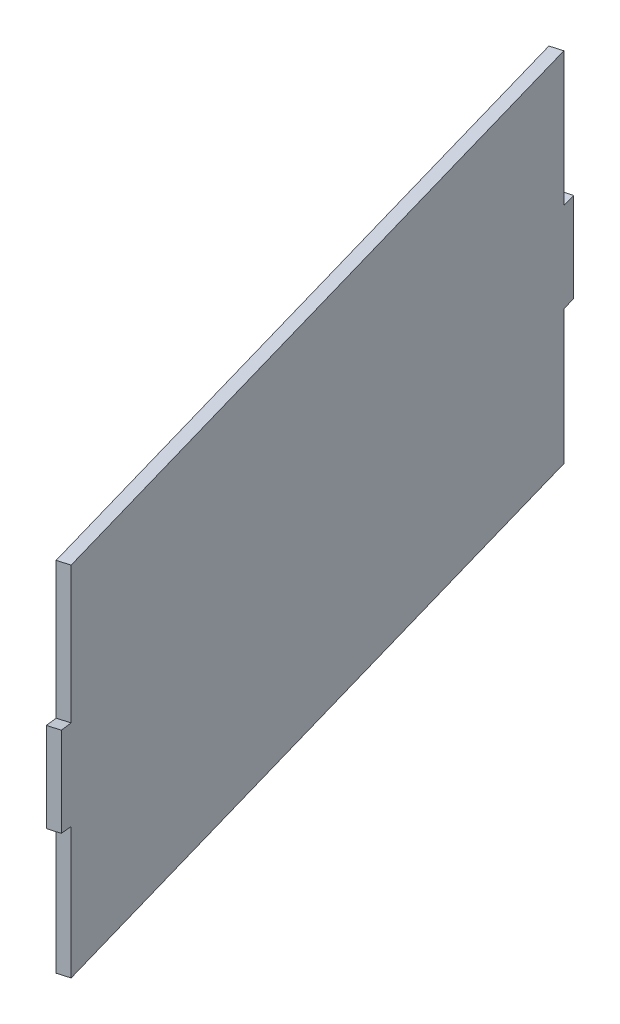
ISO-10303-21;
HEADER;
FILE_DESCRIPTION(('STEP AP214'),'2;1');
FILE_NAME('part.step','',(''),(''),'','','');
FILE_SCHEMA(('AUTOMOTIVE_DESIGN { 1 0 10303 214 1 1 1 1 }'));
ENDSEC;
DATA;
#1=APPLICATION_CONTEXT('core data for automotive mechanical design processes');
#2=APPLICATION_PROTOCOL_DEFINITION('international standard','automotive_design',2000,#1);
#3=PRODUCT_CONTEXT('',#1,'mechanical');
#4=PRODUCT('Part','Part','',(#3));
#5=PRODUCT_RELATED_PRODUCT_CATEGORY('part','',(#4));
#6=PRODUCT_DEFINITION_FORMATION('','',#4);
#7=PRODUCT_DEFINITION_CONTEXT('part definition',#1,'design');
#8=PRODUCT_DEFINITION('design','',#6,#7);
#9=PRODUCT_DEFINITION_SHAPE('','',#8);
#10=(LENGTH_UNIT() NAMED_UNIT(*) SI_UNIT(.MILLI.,.METRE.));
#11=(NAMED_UNIT(*) PLANE_ANGLE_UNIT() SI_UNIT($,.RADIAN.));
#12=(NAMED_UNIT(*) SI_UNIT($,.STERADIAN.) SOLID_ANGLE_UNIT());
#13=UNCERTAINTY_MEASURE_WITH_UNIT(LENGTH_MEASURE(1.E-05),#10,'distance_accuracy_value','');
#14=(GEOMETRIC_REPRESENTATION_CONTEXT(3) GLOBAL_UNCERTAINTY_ASSIGNED_CONTEXT((#13)) GLOBAL_UNIT_ASSIGNED_CONTEXT((#10,
#11,#12)) REPRESENTATION_CONTEXT('',''));
#15=CARTESIAN_POINT('',(0.,0.,0.));
#16=DIRECTION('',(0.,0.,1.));
#17=DIRECTION('',(1.,0.,0.));
#18=AXIS2_PLACEMENT_3D('',#15,#16,#17);
#19=CARTESIAN_POINT('',(242.936015541515,-154.081628831697,-2777.81556036248));
#20=DIRECTION('',(0.,1.,0.));
#21=DIRECTION('',(0.,0.,1.));
#22=AXIS2_PLACEMENT_3D('',#19,#20,#21);
#23=PLANE('',#22);
#24=DIRECTION('',(0.276516685703619,0.,0.961009116776467));
#25=VECTOR('',#24,1.);
#26=CARTESIAN_POINT('',(252.699868167964,-154.081628831697,-2780.62496988922));
#27=LINE('',#26,#25);
#28=CARTESIAN_POINT('',(249.381667939521,-154.081628831698,-2792.15707929054));
#29=VERTEX_POINT('',#28);
#30=CARTESIAN_POINT('',(252.699868167964,-154.081628831697,-2780.62496988922));
#31=VERTEX_POINT('',#30);
#32=EDGE_CURVE('E158',#29,#31,#27,.T.);
#33=ORIENTED_EDGE('',*,*,#32,.F.);
#34=DIRECTION('',(0.96100911677647,0.,-0.276516685703609));
#35=VECTOR('',#34,1.);
#36=CARTESIAN_POINT('',(239.617815313072,-154.081628831698,-2789.34766976379));
#37=LINE('',#36,#35);
#38=CARTESIAN_POINT('',(239.617815313072,-154.081628831698,-2789.34766976379));
#39=VERTEX_POINT('',#38);
#40=EDGE_CURVE('E11',#39,#29,#37,.T.);
#41=ORIENTED_EDGE('',*,*,#40,.F.);
#42=DIRECTION('',(0.276516685703619,0.,0.961009116776467));
#43=VECTOR('',#42,1.);
#44=CARTESIAN_POINT('',(242.936015541515,-154.081628831697,-2777.81556036248));
#45=LINE('',#44,#43);
#46=CARTESIAN_POINT('',(242.936015541515,-154.081628831697,-2777.81556036248));
#47=VERTEX_POINT('',#46);
#48=EDGE_CURVE('E190',#39,#47,#45,.T.);
#49=ORIENTED_EDGE('',*,*,#48,.T.);
#50=DIRECTION('',(0.96100911677647,0.,-0.276516685703609));
#51=VECTOR('',#50,1.);
#52=CARTESIAN_POINT('',(242.936015541515,-154.081628831697,-2777.81556036248));
#53=LINE('',#52,#51);
#54=EDGE_CURVE('E40',#47,#31,#53,.T.);
#55=ORIENTED_EDGE('',*,*,#54,.T.);
#56=EDGE_LOOP('',(#33,#41,#49,#55));
#57=FACE_BOUND('',#56,.T.);
#58=ADVANCED_FACE('F37',(#57),#23,.T.);
#59=CARTESIAN_POINT('',(239.617815313072,-154.081628831698,-2789.34766976379));
#60=DIRECTION('',(-0.276516685703609,0.,-0.96100911677647));
#61=DIRECTION('',(-0.96100911677647,0.,0.276516685703609));
#62=AXIS2_PLACEMENT_3D('',#59,#60,#61);
#63=PLANE('',#62);
#64=DIRECTION('',(0.,1.,0.));
#65=VECTOR('',#64,1.);
#66=CARTESIAN_POINT('',(249.381667939521,-154.081628831698,-2792.15707929054));
#67=LINE('',#66,#65);
#68=CARTESIAN_POINT('',(249.381667939521,-229.081628831698,-2792.15707929054));
#69=VERTEX_POINT('',#68);
#70=EDGE_CURVE('E188',#69,#29,#67,.T.);
#71=ORIENTED_EDGE('',*,*,#70,.F.);
#72=DIRECTION('',(0.96100911677647,0.,-0.276516685703609));
#73=VECTOR('',#72,1.);
#74=CARTESIAN_POINT('',(239.617815313072,-229.081628831698,-2789.34766976379));
#75=LINE('',#74,#73);
#76=CARTESIAN_POINT('',(239.617815313072,-229.081628831698,-2789.34766976379));
#77=VERTEX_POINT('',#76);
#78=EDGE_CURVE('E46',#77,#69,#75,.T.);
#79=ORIENTED_EDGE('',*,*,#78,.F.);
#80=DIRECTION('',(0.,1.,0.));
#81=VECTOR('',#80,1.);
#82=CARTESIAN_POINT('',(239.617815313072,-154.081628831698,-2789.34766976379));
#83=LINE('',#82,#81);
#84=EDGE_CURVE('E148',#77,#39,#83,.T.);
#85=ORIENTED_EDGE('',*,*,#84,.T.);
#86=ORIENTED_EDGE('',*,*,#40,.T.);
#87=EDGE_LOOP('',(#71,#79,#85,#86));
#88=FACE_BOUND('',#87,.T.);
#89=ADVANCED_FACE('F210',(#88),#63,.T.);
#90=CARTESIAN_POINT('',(239.617815313072,-229.081628831698,-2789.34766976379));
#91=DIRECTION('',(0.,-1.,0.));
#92=DIRECTION('',(1.,0.,0.));
#93=AXIS2_PLACEMENT_3D('',#90,#91,#92);
#94=PLANE('',#93);
#95=DIRECTION('',(-0.276516685703619,0.,-0.961009116776467));
#96=VECTOR('',#95,1.);
#97=CARTESIAN_POINT('',(249.381667939521,-229.081628831698,-2792.15707929054));
#98=LINE('',#97,#96);
#99=CARTESIAN_POINT('',(252.699868167964,-229.081628831698,-2780.62496988922));
#100=VERTEX_POINT('',#99);
#101=EDGE_CURVE('E135',#100,#69,#98,.T.);
#102=ORIENTED_EDGE('',*,*,#101,.F.);
#103=DIRECTION('',(0.96100911677647,0.,-0.276516685703609));
#104=VECTOR('',#103,1.);
#105=CARTESIAN_POINT('',(242.936015541515,-229.081628831698,-2777.81556036248));
#106=LINE('',#105,#104);
#107=CARTESIAN_POINT('',(242.936015541515,-229.081628831698,-2777.81556036248));
#108=VERTEX_POINT('',#107);
#109=EDGE_CURVE('E130',#108,#100,#106,.T.);
#110=ORIENTED_EDGE('',*,*,#109,.F.);
#111=DIRECTION('',(-0.276516685703619,0.,-0.961009116776467));
#112=VECTOR('',#111,1.);
#113=CARTESIAN_POINT('',(239.617815313072,-229.081628831698,-2789.34766976379));
#114=LINE('',#113,#112);
#115=EDGE_CURVE('E133',#108,#77,#114,.T.);
#116=ORIENTED_EDGE('',*,*,#115,.T.);
#117=ORIENTED_EDGE('',*,*,#78,.T.);
#118=EDGE_LOOP('',(#102,#110,#116,#117));
#119=FACE_BOUND('',#118,.T.);
#120=ADVANCED_FACE('F132',(#119),#94,.T.);
#121=CARTESIAN_POINT('',(242.936015541515,-229.081628831698,-2777.81556036248));
#122=DIRECTION('',(-0.276516685703609,0.,-0.96100911677647));
#123=DIRECTION('',(-0.96100911677647,0.,0.276516685703609));
#124=AXIS2_PLACEMENT_3D('',#121,#122,#123);
#125=PLANE('',#124);
#126=DIRECTION('',(0.,1.,0.));
#127=VECTOR('',#126,1.);
#128=CARTESIAN_POINT('',(252.699868167964,-229.081628831698,-2780.62496988922));
#129=LINE('',#128,#127);
#130=CARTESIAN_POINT('',(252.699868167964,-341.581628831697,-2780.62496988922));
#131=VERTEX_POINT('',#130);
#132=EDGE_CURVE('E185',#131,#100,#129,.T.);
#133=ORIENTED_EDGE('',*,*,#132,.F.);
#134=DIRECTION('',(0.96100911677647,0.,-0.276516685703609));
#135=VECTOR('',#134,1.);
#136=CARTESIAN_POINT('',(242.936015541515,-341.581628831697,-2777.81556036248));
#137=LINE('',#136,#135);
#138=CARTESIAN_POINT('',(242.936015541515,-341.581628831697,-2777.81556036248));
#139=VERTEX_POINT('',#138);
#140=EDGE_CURVE('E140',#139,#131,#137,.T.);
#141=ORIENTED_EDGE('',*,*,#140,.F.);
#142=DIRECTION('',(0.,1.,0.));
#143=VECTOR('',#142,1.);
#144=CARTESIAN_POINT('',(242.936015541515,-229.081628831698,-2777.81556036248));
#145=LINE('',#144,#143);
#146=EDGE_CURVE('E146',#139,#108,#145,.T.);
#147=ORIENTED_EDGE('',*,*,#146,.T.);
#148=ORIENTED_EDGE('',*,*,#109,.T.);
#149=EDGE_LOOP('',(#133,#141,#147,#148));
#150=FACE_BOUND('',#149,.T.);
#151=ADVANCED_FACE('F150',(#150),#125,.T.);
#152=CARTESIAN_POINT('',(242.936015541515,-341.581628831697,-2777.81556036248));
#153=DIRECTION('',(0.,-1.,0.));
#154=DIRECTION('',(1.,0.,0.));
#155=AXIS2_PLACEMENT_3D('',#152,#153,#154);
#156=PLANE('',#155);
#157=DIRECTION('',(-0.276516685703609,0.,-0.96100911677647));
#158=VECTOR('',#157,1.);
#159=CARTESIAN_POINT('',(252.699868167964,-341.581628831697,-2780.62496988922));
#160=LINE('',#159,#158);
#161=CARTESIAN_POINT('',(419.711839480079,-341.581628831697,-2200.18973635764));
#162=VERTEX_POINT('',#161);
#163=EDGE_CURVE('E182',#162,#131,#160,.T.);
#164=ORIENTED_EDGE('',*,*,#163,.F.);
#165=DIRECTION('',(0.96100911677647,0.,-0.276516685703609));
#166=VECTOR('',#165,1.);
#167=CARTESIAN_POINT('',(409.94798685363,-341.581628831697,-2197.3803268309));
#168=LINE('',#167,#166);
#169=CARTESIAN_POINT('',(409.94798685363,-341.581628831697,-2197.3803268309));
#170=VERTEX_POINT('',#169);
#171=EDGE_CURVE('E194',#170,#162,#168,.T.);
#172=ORIENTED_EDGE('',*,*,#171,.F.);
#173=DIRECTION('',(-0.276516685703609,0.,-0.96100911677647));
#174=VECTOR('',#173,1.);
#175=CARTESIAN_POINT('',(242.936015541515,-341.581628831697,-2777.81556036248));
#176=LINE('',#175,#174);
#177=EDGE_CURVE('E151',#170,#139,#176,.T.);
#178=ORIENTED_EDGE('',*,*,#177,.T.);
#179=ORIENTED_EDGE('',*,*,#140,.T.);
#180=EDGE_LOOP('',(#164,#172,#178,#179));
#181=FACE_BOUND('',#180,.T.);
#182=ADVANCED_FACE('F223',(#181),#156,.T.);
#183=CARTESIAN_POINT('',(409.94798685363,-231.51240132609,-2197.3803268309));
#184=DIRECTION('',(0.276516685703609,0.,0.96100911677647));
#185=DIRECTION('',(0.96100911677647,0.,-0.276516685703609));
#186=AXIS2_PLACEMENT_3D('',#183,#184,#185);
#187=PLANE('',#186);
#188=DIRECTION('',(0.,-1.,0.));
#189=VECTOR('',#188,1.);
#190=CARTESIAN_POINT('',(419.711839480079,-231.51240132609,-2200.18973635764));
#191=LINE('',#190,#189);
#192=CARTESIAN_POINT('',(419.711839480079,-231.51240132609,-2200.18973635764));
#193=VERTEX_POINT('',#192);
#194=EDGE_CURVE('E179',#193,#162,#191,.T.);
#195=ORIENTED_EDGE('',*,*,#194,.F.);
#196=DIRECTION('',(0.96100911677647,0.,-0.276516685703609));
#197=VECTOR('',#196,1.);
#198=CARTESIAN_POINT('',(409.94798685363,-231.51240132609,-2197.3803268309));
#199=LINE('',#198,#197);
#200=CARTESIAN_POINT('',(409.94798685363,-231.51240132609,-2197.3803268309));
#201=VERTEX_POINT('',#200);
#202=EDGE_CURVE('E196',#201,#193,#199,.T.);
#203=ORIENTED_EDGE('',*,*,#202,.F.);
#204=DIRECTION('',(0.,-1.,0.));
#205=VECTOR('',#204,1.);
#206=CARTESIAN_POINT('',(409.94798685363,-231.51240132609,-2197.3803268309));
#207=LINE('',#206,#205);
#208=EDGE_CURVE('E153',#201,#170,#207,.T.);
#209=ORIENTED_EDGE('',*,*,#208,.T.);
#210=ORIENTED_EDGE('',*,*,#171,.T.);
#211=EDGE_LOOP('',(#195,#203,#209,#210));
#212=FACE_BOUND('',#211,.T.);
#213=ADVANCED_FACE('F226',(#212),#187,.T.);
#214=CARTESIAN_POINT('',(413.266187082074,-229.081628831698,-2185.84821742958));
#215=DIRECTION('',(0.054897466523003,-0.98009436522182,0.190791256167033));
#216=DIRECTION('',(0.,-0.191079404473001,-0.981574582589751));
#217=AXIS2_PLACEMENT_3D('',#214,#215,#216);
#218=PLANE('',#217);
#219=DIRECTION('',(-0.271012445547912,-0.198532202074219,-0.941879620279418));
#220=VECTOR('',#219,1.);
#221=CARTESIAN_POINT('',(423.030039708523,-229.081628831698,-2188.65762695633));
#222=LINE('',#221,#220);
#223=CARTESIAN_POINT('',(423.030039708523,-229.081628831698,-2188.65762695633));
#224=VERTEX_POINT('',#223);
#225=EDGE_CURVE('E176',#224,#193,#222,.T.);
#226=ORIENTED_EDGE('',*,*,#225,.F.);
#227=DIRECTION('',(0.96100911677647,0.,-0.276516685703609));
#228=VECTOR('',#227,1.);
#229=CARTESIAN_POINT('',(413.266187082074,-229.081628831698,-2185.84821742958));
#230=LINE('',#229,#228);
#231=CARTESIAN_POINT('',(413.266187082074,-229.081628831698,-2185.84821742958));
#232=VERTEX_POINT('',#231);
#233=EDGE_CURVE('E198',#232,#224,#230,.T.);
#234=ORIENTED_EDGE('',*,*,#233,.F.);
#235=DIRECTION('',(-0.271012445547912,-0.198532202074219,-0.941879620279418));
#236=VECTOR('',#235,1.);
#237=CARTESIAN_POINT('',(413.266187082074,-229.081628831698,-2185.84821742958));
#238=LINE('',#237,#236);
#239=EDGE_CURVE('E380',#232,#201,#238,.T.);
#240=ORIENTED_EDGE('',*,*,#239,.T.);
#241=ORIENTED_EDGE('',*,*,#202,.T.);
#242=EDGE_LOOP('',(#226,#234,#240,#241));
#243=FACE_BOUND('',#242,.T.);
#244=ADVANCED_FACE('F230',(#243),#218,.T.);
#245=CARTESIAN_POINT('',(413.266187082074,-154.081628831698,-2185.84821742958));
#246=DIRECTION('',(0.276516685703609,0.,0.96100911677647));
#247=DIRECTION('',(0.96100911677647,0.,-0.276516685703609));
#248=AXIS2_PLACEMENT_3D('',#245,#246,#247);
#249=PLANE('',#248);
#250=DIRECTION('',(0.,-1.,0.));
#251=VECTOR('',#250,1.);
#252=CARTESIAN_POINT('',(423.030039708523,-154.081628831698,-2188.65762695633));
#253=LINE('',#252,#251);
#254=CARTESIAN_POINT('',(423.030039708523,-154.081628831698,-2188.65762695633));
#255=VERTEX_POINT('',#254);
#256=EDGE_CURVE('E173',#255,#224,#253,.T.);
#257=ORIENTED_EDGE('',*,*,#256,.F.);
#258=DIRECTION('',(0.96100911677647,0.,-0.276516685703609));
#259=VECTOR('',#258,1.);
#260=CARTESIAN_POINT('',(413.266187082074,-154.081628831698,-2185.84821742958));
#261=LINE('',#260,#259);
#262=CARTESIAN_POINT('',(413.266187082074,-154.081628831698,-2185.84821742958));
#263=VERTEX_POINT('',#262);
#264=EDGE_CURVE('E200',#263,#255,#261,.T.);
#265=ORIENTED_EDGE('',*,*,#264,.F.);
#266=DIRECTION('',(0.,-1.,0.));
#267=VECTOR('',#266,1.);
#268=CARTESIAN_POINT('',(413.266187082074,-154.081628831698,-2185.84821742958));
#269=LINE('',#268,#267);
#270=EDGE_CURVE('E384',#263,#232,#269,.T.);
#271=ORIENTED_EDGE('',*,*,#270,.T.);
#272=ORIENTED_EDGE('',*,*,#233,.T.);
#273=EDGE_LOOP('',(#257,#265,#271,#272));
#274=FACE_BOUND('',#273,.T.);
#275=ADVANCED_FACE('F234',(#274),#249,.T.);
#276=CARTESIAN_POINT('',(413.266187082074,-154.081628831698,-2185.84821742958));
#277=DIRECTION('',(-0.0492613335281761,0.98400341687963,-0.171203377852887));
#278=DIRECTION('',(0.,0.171411484504855,0.985199524451693));
#279=AXIS2_PLACEMENT_3D('',#276,#277,#278);
#280=PLANE('',#279);
#281=DIRECTION('',(0.272093363556582,0.178149587620102,0.945636254560522));
#282=VECTOR('',#281,1.);
#283=CARTESIAN_POINT('',(423.030039708523,-154.081628831698,-2188.65762695633));
#284=LINE('',#283,#282);
#285=CARTESIAN_POINT('',(419.711839480079,-156.254177234243,-2200.18973635764));
#286=VERTEX_POINT('',#285);
#287=EDGE_CURVE('E170',#286,#255,#284,.T.);
#288=ORIENTED_EDGE('',*,*,#287,.F.);
#289=DIRECTION('',(0.96100911677647,0.,-0.276516685703609));
#290=VECTOR('',#289,1.);
#291=CARTESIAN_POINT('',(409.94798685363,-156.254177234243,-2197.3803268309));
#292=LINE('',#291,#290);
#293=CARTESIAN_POINT('',(409.94798685363,-156.254177234243,-2197.3803268309));
#294=VERTEX_POINT('',#293);
#295=EDGE_CURVE('E202',#294,#286,#292,.T.);
#296=ORIENTED_EDGE('',*,*,#295,.F.);
#297=DIRECTION('',(0.272093363556582,0.178149587620102,0.945636254560522));
#298=VECTOR('',#297,1.);
#299=CARTESIAN_POINT('',(413.266187082074,-154.081628831698,-2185.84821742958));
#300=LINE('',#299,#298);
#301=EDGE_CURVE('E373',#294,#263,#300,.T.);
#302=ORIENTED_EDGE('',*,*,#301,.T.);
#303=ORIENTED_EDGE('',*,*,#264,.T.);
#304=EDGE_LOOP('',(#288,#296,#302,#303));
#305=FACE_BOUND('',#304,.T.);
#306=ADVANCED_FACE('F238',(#305),#280,.T.);
#307=CARTESIAN_POINT('',(409.94798685363,-41.5816288316975,-2197.3803268309));
#308=DIRECTION('',(0.276516685703609,0.,0.96100911677647));
#309=DIRECTION('',(0.96100911677647,0.,-0.276516685703609));
#310=AXIS2_PLACEMENT_3D('',#307,#308,#309);
#311=PLANE('',#310);
#312=DIRECTION('',(0.,-1.,0.));
#313=VECTOR('',#312,1.);
#314=CARTESIAN_POINT('',(419.711839480079,-41.5816288316975,-2200.18973635764));
#315=LINE('',#314,#313);
#316=CARTESIAN_POINT('',(419.711839480079,-41.5816288316975,-2200.18973635764));
#317=VERTEX_POINT('',#316);
#318=EDGE_CURVE('E167',#317,#286,#315,.T.);
#319=ORIENTED_EDGE('',*,*,#318,.F.);
#320=DIRECTION('',(0.96100911677647,0.,-0.276516685703609));
#321=VECTOR('',#320,1.);
#322=CARTESIAN_POINT('',(409.94798685363,-41.5816288316975,-2197.3803268309));
#323=LINE('',#322,#321);
#324=CARTESIAN_POINT('',(409.94798685363,-41.5816288316975,-2197.3803268309));
#325=VERTEX_POINT('',#324);
#326=EDGE_CURVE('E204',#325,#317,#323,.T.);
#327=ORIENTED_EDGE('',*,*,#326,.F.);
#328=DIRECTION('',(0.,-1.,0.));
#329=VECTOR('',#328,1.);
#330=CARTESIAN_POINT('',(409.94798685363,-41.5816288316975,-2197.3803268309));
#331=LINE('',#330,#329);
#332=EDGE_CURVE('E369',#325,#294,#331,.T.);
#333=ORIENTED_EDGE('',*,*,#332,.T.);
#334=ORIENTED_EDGE('',*,*,#295,.T.);
#335=EDGE_LOOP('',(#319,#327,#333,#334));
#336=FACE_BOUND('',#335,.T.);
#337=ADVANCED_FACE('F242',(#336),#311,.T.);
#338=CARTESIAN_POINT('',(242.936015541515,-41.5816288316974,-2777.81556036248));
#339=DIRECTION('',(0.,1.,0.));
#340=DIRECTION('',(-1.,0.,0.));
#341=AXIS2_PLACEMENT_3D('',#338,#339,#340);
#342=PLANE('',#341);
#343=DIRECTION('',(0.276516685703609,0.,0.96100911677647));
#344=VECTOR('',#343,1.);
#345=CARTESIAN_POINT('',(252.699868167964,-41.5816288316974,-2780.62496988922));
#346=LINE('',#345,#344);
#347=CARTESIAN_POINT('',(252.699868167964,-41.5816288316974,-2780.62496988922));
#348=VERTEX_POINT('',#347);
#349=EDGE_CURVE('E164',#348,#317,#346,.T.);
#350=ORIENTED_EDGE('',*,*,#349,.F.);
#351=DIRECTION('',(0.96100911677647,0.,-0.276516685703609));
#352=VECTOR('',#351,1.);
#353=CARTESIAN_POINT('',(242.936015541515,-41.5816288316974,-2777.81556036248));
#354=LINE('',#353,#352);
#355=CARTESIAN_POINT('',(242.936015541515,-41.5816288316974,-2777.81556036248));
#356=VERTEX_POINT('',#355);
#357=EDGE_CURVE('E205',#356,#348,#354,.T.);
#358=ORIENTED_EDGE('',*,*,#357,.F.);
#359=DIRECTION('',(0.276516685703609,0.,0.96100911677647));
#360=VECTOR('',#359,1.);
#361=CARTESIAN_POINT('',(242.936015541515,-41.5816288316974,-2777.81556036248));
#362=LINE('',#361,#360);
#363=EDGE_CURVE('E390',#356,#325,#362,.T.);
#364=ORIENTED_EDGE('',*,*,#363,.T.);
#365=ORIENTED_EDGE('',*,*,#326,.T.);
#366=EDGE_LOOP('',(#350,#358,#364,#365));
#367=FACE_BOUND('',#366,.T.);
#368=ADVANCED_FACE('F246',(#367),#342,.T.);
#369=CARTESIAN_POINT('',(242.936015541515,-41.5816288316974,-2777.81556036248));
#370=DIRECTION('',(-0.276516685703609,0.,-0.96100911677647));
#371=DIRECTION('',(-0.96100911677647,0.,0.276516685703609));
#372=AXIS2_PLACEMENT_3D('',#369,#370,#371);
#373=PLANE('',#372);
#374=DIRECTION('',(0.,1.,0.));
#375=VECTOR('',#374,1.);
#376=CARTESIAN_POINT('',(252.699868167964,-41.5816288316974,-2780.62496988922));
#377=LINE('',#376,#375);
#378=EDGE_CURVE('E161',#31,#348,#377,.T.);
#379=ORIENTED_EDGE('',*,*,#378,.F.);
#380=ORIENTED_EDGE('',*,*,#54,.F.);
#381=DIRECTION('',(0.,1.,0.));
#382=VECTOR('',#381,1.);
#383=CARTESIAN_POINT('',(242.936015541515,-41.5816288316974,-2777.81556036248));
#384=LINE('',#383,#382);
#385=EDGE_CURVE('E392',#47,#356,#384,.T.);
#386=ORIENTED_EDGE('',*,*,#385,.T.);
#387=ORIENTED_EDGE('',*,*,#357,.T.);
#388=EDGE_LOOP('',(#379,#380,#386,#387));
#389=FACE_BOUND('',#388,.T.);
#390=ADVANCED_FACE('F207',(#389),#373,.T.);
#391=CARTESIAN_POINT('',(962.523742080268,0.,-276.952497561986));
#392=DIRECTION('',(-0.961009116776468,0.,0.276516685703619));
#393=DIRECTION('',(0.276516685703619,0.,0.961009116776467));
#394=AXIS2_PLACEMENT_3D('',#391,#392,#393);
#395=PLANE('',#394);
#396=ORIENTED_EDGE('',*,*,#48,.F.);
#397=ORIENTED_EDGE('',*,*,#84,.F.);
#398=ORIENTED_EDGE('',*,*,#115,.F.);
#399=ORIENTED_EDGE('',*,*,#146,.F.);
#400=ORIENTED_EDGE('',*,*,#177,.F.);
#401=ORIENTED_EDGE('',*,*,#208,.F.);
#402=ORIENTED_EDGE('',*,*,#239,.F.);
#403=ORIENTED_EDGE('',*,*,#270,.F.);
#404=ORIENTED_EDGE('',*,*,#301,.F.);
#405=ORIENTED_EDGE('',*,*,#332,.F.);
#406=ORIENTED_EDGE('',*,*,#363,.F.);
#407=ORIENTED_EDGE('',*,*,#385,.F.);
#408=EDGE_LOOP('',(#396,#397,#398,#399,#400,#401,#402,#403,#404,#405,#406,#407));
#409=FACE_BOUND('',#408,.T.);
#410=ADVANCED_FACE('F144',(#409),#395,.T.);
#411=CARTESIAN_POINT('',(972.287594706717,0.,-279.761907088735));
#412=DIRECTION('',(-0.961009116776468,0.,0.276516685703619));
#413=DIRECTION('',(0.276516685703619,0.,0.961009116776467));
#414=AXIS2_PLACEMENT_3D('',#411,#412,#413);
#415=PLANE('',#414);
#416=ORIENTED_EDGE('',*,*,#32,.T.);
#417=ORIENTED_EDGE('',*,*,#378,.T.);
#418=ORIENTED_EDGE('',*,*,#349,.T.);
#419=ORIENTED_EDGE('',*,*,#318,.T.);
#420=ORIENTED_EDGE('',*,*,#287,.T.);
#421=ORIENTED_EDGE('',*,*,#256,.T.);
#422=ORIENTED_EDGE('',*,*,#225,.T.);
#423=ORIENTED_EDGE('',*,*,#194,.T.);
#424=ORIENTED_EDGE('',*,*,#163,.T.);
#425=ORIENTED_EDGE('',*,*,#132,.T.);
#426=ORIENTED_EDGE('',*,*,#101,.T.);
#427=ORIENTED_EDGE('',*,*,#70,.T.);
#428=EDGE_LOOP('',(#416,#417,#418,#419,#420,#421,#422,#423,#424,#425,#426,#427));
#429=FACE_BOUND('',#428,.T.);
#430=ADVANCED_FACE('F209',(#429),#415,.F.);
#431=CLOSED_SHELL('',(#58,#89,#120,#151,#182,#213,#244,#275,#306,#337,#368,#390,#410,#430));
#432=MANIFOLD_SOLID_BREP('B2',#431);
#433=ADVANCED_BREP_SHAPE_REPRESENTATION('',(#18,#432),#14);
#434=SHAPE_DEFINITION_REPRESENTATION(#9,#433);
ENDSEC;
END-ISO-10303-21;
